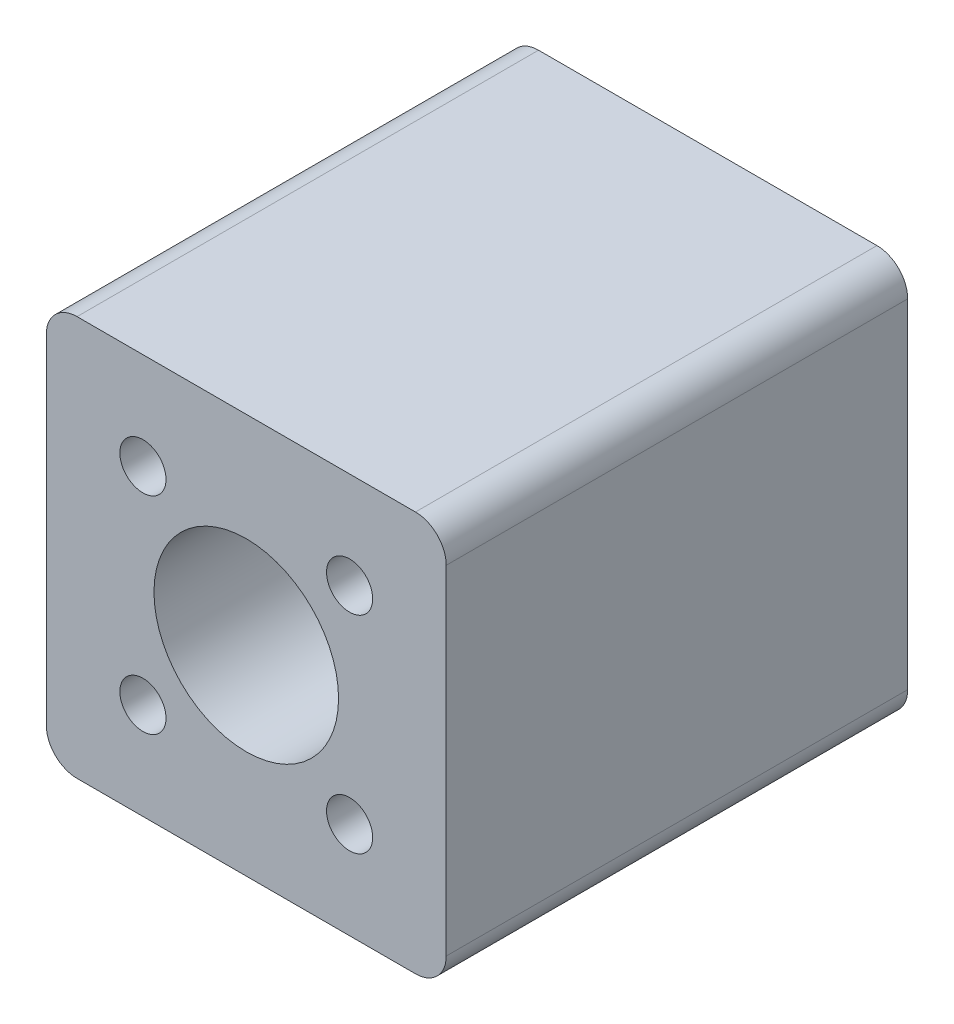
ISO-10303-21;
HEADER;
FILE_DESCRIPTION(('STEP AP214'),'2;1');
FILE_NAME('part.step','',(''),(''),'','','');
FILE_SCHEMA(('AUTOMOTIVE_DESIGN { 1 0 10303 214 1 1 1 1 }'));
ENDSEC;
DATA;
#1=APPLICATION_CONTEXT('core data for automotive mechanical design processes');
#2=APPLICATION_PROTOCOL_DEFINITION('international standard','automotive_design',2000,#1);
#3=PRODUCT_CONTEXT('',#1,'mechanical');
#4=PRODUCT('Part','Part','',(#3));
#5=PRODUCT_RELATED_PRODUCT_CATEGORY('part','',(#4));
#6=PRODUCT_DEFINITION_FORMATION('','',#4);
#7=PRODUCT_DEFINITION_CONTEXT('part definition',#1,'design');
#8=PRODUCT_DEFINITION('design','',#6,#7);
#9=PRODUCT_DEFINITION_SHAPE('','',#8);
#10=(LENGTH_UNIT() NAMED_UNIT(*) SI_UNIT(.MILLI.,.METRE.));
#11=(NAMED_UNIT(*) PLANE_ANGLE_UNIT() SI_UNIT($,.RADIAN.));
#12=(NAMED_UNIT(*) SI_UNIT($,.STERADIAN.) SOLID_ANGLE_UNIT());
#13=UNCERTAINTY_MEASURE_WITH_UNIT(LENGTH_MEASURE(1.E-05),#10,'distance_accuracy_value','');
#14=(GEOMETRIC_REPRESENTATION_CONTEXT(3) GLOBAL_UNCERTAINTY_ASSIGNED_CONTEXT((#13)) GLOBAL_UNIT_ASSIGNED_CONTEXT((#10,
#11,#12)) REPRESENTATION_CONTEXT('',''));
#15=CARTESIAN_POINT('',(0.,0.,0.));
#16=DIRECTION('',(0.,0.,1.));
#17=DIRECTION('',(1.,0.,0.));
#18=AXIS2_PLACEMENT_3D('',#15,#16,#17);
#19=CARTESIAN_POINT('',(-11.,11.,30.));
#20=DIRECTION('',(0.,0.,-1.));
#21=DIRECTION('',(-1.,0.,0.));
#22=AXIS2_PLACEMENT_3D('',#19,#20,#21);
#23=PLANE('',#22);
#24=CARTESIAN_POINT('',(-11.,11.,30.));
#25=DIRECTION('',(0.,0.,1.));
#26=DIRECTION('',(-1.,0.,0.));
#27=AXIS2_PLACEMENT_3D('',#24,#25,#26);
#28=CIRCLE('',#27,2.);
#29=CARTESIAN_POINT('',(-11.,13.,30.));
#30=VERTEX_POINT('',#29);
#31=CARTESIAN_POINT('',(-13.,11.,30.));
#32=VERTEX_POINT('',#31);
#33=EDGE_CURVE('E153',#30,#32,#28,.T.);
#34=ORIENTED_EDGE('',*,*,#33,.T.);
#35=DIRECTION('',(0.,-1.,0.));
#36=VECTOR('',#35,1.);
#37=CARTESIAN_POINT('',(-13.,-11.,30.));
#38=LINE('',#37,#36);
#39=CARTESIAN_POINT('',(-13.,-11.,30.));
#40=VERTEX_POINT('',#39);
#41=EDGE_CURVE('E97',#32,#40,#38,.T.);
#42=ORIENTED_EDGE('',*,*,#41,.T.);
#43=CARTESIAN_POINT('',(-11.,-11.,30.));
#44=DIRECTION('',(0.,0.,1.));
#45=DIRECTION('',(1.,0.,0.));
#46=AXIS2_PLACEMENT_3D('',#43,#44,#45);
#47=CIRCLE('',#46,2.);
#48=CARTESIAN_POINT('',(-11.,-13.,30.));
#49=VERTEX_POINT('',#48);
#50=EDGE_CURVE('E168',#40,#49,#47,.T.);
#51=ORIENTED_EDGE('',*,*,#50,.T.);
#52=DIRECTION('',(1.,0.,0.));
#53=VECTOR('',#52,1.);
#54=CARTESIAN_POINT('',(11.,-13.,30.));
#55=LINE('',#54,#53);
#56=CARTESIAN_POINT('',(11.,-13.,30.));
#57=VERTEX_POINT('',#56);
#58=EDGE_CURVE('E179',#49,#57,#55,.T.);
#59=ORIENTED_EDGE('',*,*,#58,.T.);
#60=CARTESIAN_POINT('',(11.,-11.,30.));
#61=DIRECTION('',(0.,0.,1.));
#62=DIRECTION('',(1.,0.,0.));
#63=AXIS2_PLACEMENT_3D('',#60,#61,#62);
#64=CIRCLE('',#63,2.);
#65=CARTESIAN_POINT('',(13.,-11.,30.));
#66=VERTEX_POINT('',#65);
#67=EDGE_CURVE('E117',#57,#66,#64,.T.);
#68=ORIENTED_EDGE('',*,*,#67,.T.);
#69=DIRECTION('',(0.,1.,0.));
#70=VECTOR('',#69,1.);
#71=CARTESIAN_POINT('',(13.,11.,30.));
#72=LINE('',#71,#70);
#73=CARTESIAN_POINT('',(13.,11.,30.));
#74=VERTEX_POINT('',#73);
#75=EDGE_CURVE('E110',#66,#74,#72,.T.);
#76=ORIENTED_EDGE('',*,*,#75,.T.);
#77=CARTESIAN_POINT('',(11.,11.,30.));
#78=DIRECTION('',(0.,0.,1.));
#79=DIRECTION('',(1.,0.,0.));
#80=AXIS2_PLACEMENT_3D('',#77,#78,#79);
#81=CIRCLE('',#80,2.);
#82=CARTESIAN_POINT('',(11.,13.,30.));
#83=VERTEX_POINT('',#82);
#84=EDGE_CURVE('E114',#74,#83,#81,.T.);
#85=ORIENTED_EDGE('',*,*,#84,.T.);
#86=DIRECTION('',(-1.,0.,0.));
#87=VECTOR('',#86,1.);
#88=CARTESIAN_POINT('',(0.,13.,30.));
#89=LINE('',#88,#87);
#90=EDGE_CURVE('E56',#83,#30,#89,.T.);
#91=ORIENTED_EDGE('',*,*,#90,.T.);
#92=EDGE_LOOP('',(#34,#42,#51,#59,#68,#76,#85,#91));
#93=FACE_BOUND('',#92,.T.);
#94=CARTESIAN_POINT('',(0.,0.,30.));
#95=DIRECTION('',(0.,0.,1.));
#96=DIRECTION('',(1.,0.,0.));
#97=AXIS2_PLACEMENT_3D('',#94,#95,#96);
#98=CIRCLE('',#97,6.);
#99=CARTESIAN_POINT('',(6.,0.,30.));
#100=VERTEX_POINT('',#99);
#101=EDGE_CURVE('E141',#100,#100,#98,.T.);
#102=ORIENTED_EDGE('',*,*,#101,.F.);
#103=EDGE_LOOP('',(#102));
#104=FACE_BOUND('',#103,.T.);
#105=CARTESIAN_POINT('',(-6.7175144212722,6.7175144212722,30.));
#106=DIRECTION('',(0.,0.,1.));
#107=DIRECTION('',(1.,0.,0.));
#108=AXIS2_PLACEMENT_3D('',#105,#106,#107);
#109=CIRCLE('',#108,1.5);
#110=CARTESIAN_POINT('',(-5.2175144212722,6.7175144212722,30.));
#111=VERTEX_POINT('',#110);
#112=EDGE_CURVE('E188',#111,#111,#109,.T.);
#113=ORIENTED_EDGE('',*,*,#112,.F.);
#114=EDGE_LOOP('',(#113));
#115=FACE_BOUND('',#114,.T.);
#116=CARTESIAN_POINT('',(6.7175144212722,6.7175144212722,30.));
#117=DIRECTION('',(0.,0.,1.));
#118=DIRECTION('',(1.,0.,0.));
#119=AXIS2_PLACEMENT_3D('',#116,#117,#118);
#120=CIRCLE('',#119,1.5);
#121=CARTESIAN_POINT('',(8.2175144212722,6.7175144212722,30.));
#122=VERTEX_POINT('',#121);
#123=EDGE_CURVE('E194',#122,#122,#120,.T.);
#124=ORIENTED_EDGE('',*,*,#123,.F.);
#125=EDGE_LOOP('',(#124));
#126=FACE_BOUND('',#125,.T.);
#127=CARTESIAN_POINT('',(-6.7175144212722,-6.7175144212722,30.));
#128=DIRECTION('',(0.,0.,1.));
#129=DIRECTION('',(1.,0.,0.));
#130=AXIS2_PLACEMENT_3D('',#127,#128,#129);
#131=CIRCLE('',#130,1.5);
#132=CARTESIAN_POINT('',(-5.2175144212722,-6.7175144212722,30.));
#133=VERTEX_POINT('',#132);
#134=EDGE_CURVE('E200',#133,#133,#131,.T.);
#135=ORIENTED_EDGE('',*,*,#134,.F.);
#136=EDGE_LOOP('',(#135));
#137=FACE_BOUND('',#136,.T.);
#138=CARTESIAN_POINT('',(6.7175144212722,-6.7175144212722,30.));
#139=DIRECTION('',(0.,0.,1.));
#140=DIRECTION('',(1.,0.,0.));
#141=AXIS2_PLACEMENT_3D('',#138,#139,#140);
#142=CIRCLE('',#141,1.5);
#143=CARTESIAN_POINT('',(8.2175144212722,-6.7175144212722,30.));
#144=VERTEX_POINT('',#143);
#145=EDGE_CURVE('E206',#144,#144,#142,.T.);
#146=ORIENTED_EDGE('',*,*,#145,.F.);
#147=EDGE_LOOP('',(#146));
#148=FACE_BOUND('',#147,.T.);
#149=ADVANCED_FACE('F39',(#93,#104,#115,#126,#137,#148),#23,.F.);
#150=CARTESIAN_POINT('',(-11.,11.,0.));
#151=DIRECTION('',(0.,0.,-1.));
#152=DIRECTION('',(-1.,0.,0.));
#153=AXIS2_PLACEMENT_3D('',#150,#151,#152);
#154=PLANE('',#153);
#155=CARTESIAN_POINT('',(-6.7175144212722,-6.7175144212722,0.));
#156=DIRECTION('',(0.,0.,1.));
#157=DIRECTION('',(1.,0.,0.));
#158=AXIS2_PLACEMENT_3D('',#155,#156,#157);
#159=CIRCLE('',#158,1.5);
#160=CARTESIAN_POINT('',(-5.2175144212722,-6.7175144212722,0.));
#161=VERTEX_POINT('',#160);
#162=EDGE_CURVE('E203',#161,#161,#159,.T.);
#163=ORIENTED_EDGE('',*,*,#162,.T.);
#164=EDGE_LOOP('',(#163));
#165=FACE_BOUND('',#164,.T.);
#166=CARTESIAN_POINT('',(-6.7175144212722,6.7175144212722,0.));
#167=DIRECTION('',(0.,0.,1.));
#168=DIRECTION('',(1.,0.,0.));
#169=AXIS2_PLACEMENT_3D('',#166,#167,#168);
#170=CIRCLE('',#169,1.5);
#171=CARTESIAN_POINT('',(-5.2175144212722,6.7175144212722,0.));
#172=VERTEX_POINT('',#171);
#173=EDGE_CURVE('E191',#172,#172,#170,.T.);
#174=ORIENTED_EDGE('',*,*,#173,.T.);
#175=EDGE_LOOP('',(#174));
#176=FACE_BOUND('',#175,.T.);
#177=CARTESIAN_POINT('',(-11.,11.,0.));
#178=DIRECTION('',(0.,0.,1.));
#179=DIRECTION('',(-1.,0.,0.));
#180=AXIS2_PLACEMENT_3D('',#177,#178,#179);
#181=CIRCLE('',#180,2.);
#182=CARTESIAN_POINT('',(-11.,13.,0.));
#183=VERTEX_POINT('',#182);
#184=CARTESIAN_POINT('',(-13.,11.,0.));
#185=VERTEX_POINT('',#184);
#186=EDGE_CURVE('E137',#183,#185,#181,.T.);
#187=ORIENTED_EDGE('',*,*,#186,.F.);
#188=DIRECTION('',(-1.,0.,0.));
#189=VECTOR('',#188,1.);
#190=CARTESIAN_POINT('',(-11.,13.,0.));
#191=LINE('',#190,#189);
#192=CARTESIAN_POINT('',(11.,13.,0.));
#193=VERTEX_POINT('',#192);
#194=EDGE_CURVE('E85',#193,#183,#191,.T.);
#195=ORIENTED_EDGE('',*,*,#194,.F.);
#196=CARTESIAN_POINT('',(11.,11.,0.));
#197=DIRECTION('',(0.,0.,1.));
#198=DIRECTION('',(1.,0.,0.));
#199=AXIS2_PLACEMENT_3D('',#196,#197,#198);
#200=CIRCLE('',#199,2.);
#201=CARTESIAN_POINT('',(13.,11.,0.));
#202=VERTEX_POINT('',#201);
#203=EDGE_CURVE('E150',#202,#193,#200,.T.);
#204=ORIENTED_EDGE('',*,*,#203,.F.);
#205=DIRECTION('',(0.,1.,0.));
#206=VECTOR('',#205,1.);
#207=CARTESIAN_POINT('',(13.,11.,0.));
#208=LINE('',#207,#206);
#209=CARTESIAN_POINT('',(13.,-11.,0.));
#210=VERTEX_POINT('',#209);
#211=EDGE_CURVE('E126',#210,#202,#208,.T.);
#212=ORIENTED_EDGE('',*,*,#211,.F.);
#213=CARTESIAN_POINT('',(11.,-11.,0.));
#214=DIRECTION('',(0.,0.,1.));
#215=DIRECTION('',(1.,0.,0.));
#216=AXIS2_PLACEMENT_3D('',#213,#214,#215);
#217=CIRCLE('',#216,2.);
#218=CARTESIAN_POINT('',(11.,-13.,0.));
#219=VERTEX_POINT('',#218);
#220=EDGE_CURVE('E147',#219,#210,#217,.T.);
#221=ORIENTED_EDGE('',*,*,#220,.F.);
#222=DIRECTION('',(1.,0.,0.));
#223=VECTOR('',#222,1.);
#224=CARTESIAN_POINT('',(11.,-13.,0.));
#225=LINE('',#224,#223);
#226=CARTESIAN_POINT('',(-11.,-13.,0.));
#227=VERTEX_POINT('',#226);
#228=EDGE_CURVE('E145',#227,#219,#225,.T.);
#229=ORIENTED_EDGE('',*,*,#228,.F.);
#230=CARTESIAN_POINT('',(-11.,-11.,0.));
#231=DIRECTION('',(0.,0.,1.));
#232=DIRECTION('',(1.,0.,0.));
#233=AXIS2_PLACEMENT_3D('',#230,#231,#232);
#234=CIRCLE('',#233,2.);
#235=CARTESIAN_POINT('',(-13.,-11.,0.));
#236=VERTEX_POINT('',#235);
#237=EDGE_CURVE('E143',#236,#227,#234,.T.);
#238=ORIENTED_EDGE('',*,*,#237,.F.);
#239=DIRECTION('',(0.,-1.,0.));
#240=VECTOR('',#239,1.);
#241=CARTESIAN_POINT('',(-13.,-11.,0.));
#242=LINE('',#241,#240);
#243=EDGE_CURVE('E140',#185,#236,#242,.T.);
#244=ORIENTED_EDGE('',*,*,#243,.F.);
#245=EDGE_LOOP('',(#187,#195,#204,#212,#221,#229,#238,#244));
#246=FACE_BOUND('',#245,.T.);
#247=CARTESIAN_POINT('',(0.,0.,0.));
#248=DIRECTION('',(0.,0.,1.));
#249=DIRECTION('',(1.,0.,0.));
#250=AXIS2_PLACEMENT_3D('',#247,#248,#249);
#251=CIRCLE('',#250,6.);
#252=CARTESIAN_POINT('',(6.,0.,0.));
#253=VERTEX_POINT('',#252);
#254=EDGE_CURVE('E185',#253,#253,#251,.T.);
#255=ORIENTED_EDGE('',*,*,#254,.T.);
#256=EDGE_LOOP('',(#255));
#257=FACE_BOUND('',#256,.T.);
#258=CARTESIAN_POINT('',(6.7175144212722,6.7175144212722,0.));
#259=DIRECTION('',(0.,0.,1.));
#260=DIRECTION('',(1.,0.,0.));
#261=AXIS2_PLACEMENT_3D('',#258,#259,#260);
#262=CIRCLE('',#261,1.5);
#263=CARTESIAN_POINT('',(8.2175144212722,6.7175144212722,0.));
#264=VERTEX_POINT('',#263);
#265=EDGE_CURVE('E197',#264,#264,#262,.T.);
#266=ORIENTED_EDGE('',*,*,#265,.T.);
#267=EDGE_LOOP('',(#266));
#268=FACE_BOUND('',#267,.T.);
#269=CARTESIAN_POINT('',(6.7175144212722,-6.7175144212722,0.));
#270=DIRECTION('',(0.,0.,1.));
#271=DIRECTION('',(1.,0.,0.));
#272=AXIS2_PLACEMENT_3D('',#269,#270,#271);
#273=CIRCLE('',#272,1.5);
#274=CARTESIAN_POINT('',(8.2175144212722,-6.7175144212722,0.));
#275=VERTEX_POINT('',#274);
#276=EDGE_CURVE('E209',#275,#275,#273,.T.);
#277=ORIENTED_EDGE('',*,*,#276,.T.);
#278=EDGE_LOOP('',(#277));
#279=FACE_BOUND('',#278,.T.);
#280=ADVANCED_FACE('F170',(#165,#176,#246,#257,#268,#279),#154,.T.);
#281=CARTESIAN_POINT('',(-11.,11.,30.));
#282=DIRECTION('',(0.,0.,-1.));
#283=DIRECTION('',(-1.,0.,0.));
#284=AXIS2_PLACEMENT_3D('',#281,#282,#283);
#285=CYLINDRICAL_SURFACE('',#284,2.);
#286=ORIENTED_EDGE('',*,*,#186,.T.);
#287=DIRECTION('',(0.,0.,-1.));
#288=VECTOR('',#287,1.);
#289=CARTESIAN_POINT('',(-13.,11.,30.));
#290=LINE('',#289,#288);
#291=EDGE_CURVE('E11',#32,#185,#290,.T.);
#292=ORIENTED_EDGE('',*,*,#291,.F.);
#293=ORIENTED_EDGE('',*,*,#33,.F.);
#294=DIRECTION('',(0.,0.,-1.));
#295=VECTOR('',#294,1.);
#296=CARTESIAN_POINT('',(-11.,13.,30.));
#297=LINE('',#296,#295);
#298=EDGE_CURVE('E133',#30,#183,#297,.T.);
#299=ORIENTED_EDGE('',*,*,#298,.T.);
#300=EDGE_LOOP('',(#286,#292,#293,#299));
#301=FACE_BOUND('',#300,.T.);
#302=ADVANCED_FACE('F41',(#301),#285,.T.);
#303=CARTESIAN_POINT('',(-13.,-11.,30.));
#304=DIRECTION('',(1.,0.,0.));
#305=DIRECTION('',(0.,0.,-1.));
#306=AXIS2_PLACEMENT_3D('',#303,#304,#305);
#307=PLANE('',#306);
#308=ORIENTED_EDGE('',*,*,#243,.T.);
#309=DIRECTION('',(0.,0.,-1.));
#310=VECTOR('',#309,1.);
#311=CARTESIAN_POINT('',(-13.,-11.,30.));
#312=LINE('',#311,#310);
#313=EDGE_CURVE('E48',#40,#236,#312,.T.);
#314=ORIENTED_EDGE('',*,*,#313,.F.);
#315=ORIENTED_EDGE('',*,*,#41,.F.);
#316=ORIENTED_EDGE('',*,*,#291,.T.);
#317=EDGE_LOOP('',(#308,#314,#315,#316));
#318=FACE_BOUND('',#317,.T.);
#319=ADVANCED_FACE('F241',(#318),#307,.F.);
#320=CARTESIAN_POINT('',(-11.,-11.,30.));
#321=DIRECTION('',(0.,0.,-1.));
#322=DIRECTION('',(-1.,0.,0.));
#323=AXIS2_PLACEMENT_3D('',#320,#321,#322);
#324=CYLINDRICAL_SURFACE('',#323,2.);
#325=ORIENTED_EDGE('',*,*,#237,.T.);
#326=DIRECTION('',(0.,0.,-1.));
#327=VECTOR('',#326,1.);
#328=CARTESIAN_POINT('',(-11.,-13.,30.));
#329=LINE('',#328,#327);
#330=EDGE_CURVE('E160',#49,#227,#329,.T.);
#331=ORIENTED_EDGE('',*,*,#330,.F.);
#332=ORIENTED_EDGE('',*,*,#50,.F.);
#333=ORIENTED_EDGE('',*,*,#313,.T.);
#334=EDGE_LOOP('',(#325,#331,#332,#333));
#335=FACE_BOUND('',#334,.T.);
#336=ADVANCED_FACE('F166',(#335),#324,.T.);
#337=CARTESIAN_POINT('',(11.,-13.,30.));
#338=DIRECTION('',(0.,1.,0.));
#339=DIRECTION('',(0.,0.,1.));
#340=AXIS2_PLACEMENT_3D('',#337,#338,#339);
#341=PLANE('',#340);
#342=ORIENTED_EDGE('',*,*,#228,.T.);
#343=DIRECTION('',(0.,0.,-1.));
#344=VECTOR('',#343,1.);
#345=CARTESIAN_POINT('',(11.,-13.,30.));
#346=LINE('',#345,#344);
#347=EDGE_CURVE('E157',#57,#219,#346,.T.);
#348=ORIENTED_EDGE('',*,*,#347,.F.);
#349=ORIENTED_EDGE('',*,*,#58,.F.);
#350=ORIENTED_EDGE('',*,*,#330,.T.);
#351=EDGE_LOOP('',(#342,#348,#349,#350));
#352=FACE_BOUND('',#351,.T.);
#353=ADVANCED_FACE('F175',(#352),#341,.F.);
#354=CARTESIAN_POINT('',(11.,-11.,30.));
#355=DIRECTION('',(0.,0.,-1.));
#356=DIRECTION('',(-1.,0.,0.));
#357=AXIS2_PLACEMENT_3D('',#354,#355,#356);
#358=CYLINDRICAL_SURFACE('',#357,2.);
#359=ORIENTED_EDGE('',*,*,#220,.T.);
#360=DIRECTION('',(0.,0.,-1.));
#361=VECTOR('',#360,1.);
#362=CARTESIAN_POINT('',(13.,-11.,30.));
#363=LINE('',#362,#361);
#364=EDGE_CURVE('E128',#66,#210,#363,.T.);
#365=ORIENTED_EDGE('',*,*,#364,.F.);
#366=ORIENTED_EDGE('',*,*,#67,.F.);
#367=ORIENTED_EDGE('',*,*,#347,.T.);
#368=EDGE_LOOP('',(#359,#365,#366,#367));
#369=FACE_BOUND('',#368,.T.);
#370=ADVANCED_FACE('F178',(#369),#358,.T.);
#371=CARTESIAN_POINT('',(13.,11.,30.));
#372=DIRECTION('',(-1.,0.,0.));
#373=DIRECTION('',(0.,0.,1.));
#374=AXIS2_PLACEMENT_3D('',#371,#372,#373);
#375=PLANE('',#374);
#376=ORIENTED_EDGE('',*,*,#211,.T.);
#377=DIRECTION('',(0.,0.,-1.));
#378=VECTOR('',#377,1.);
#379=CARTESIAN_POINT('',(13.,11.,30.));
#380=LINE('',#379,#378);
#381=EDGE_CURVE('E123',#74,#202,#380,.T.);
#382=ORIENTED_EDGE('',*,*,#381,.F.);
#383=ORIENTED_EDGE('',*,*,#75,.F.);
#384=ORIENTED_EDGE('',*,*,#364,.T.);
#385=EDGE_LOOP('',(#376,#382,#383,#384));
#386=FACE_BOUND('',#385,.T.);
#387=ADVANCED_FACE('F124',(#386),#375,.F.);
#388=CARTESIAN_POINT('',(11.,11.,30.));
#389=DIRECTION('',(0.,0.,-1.));
#390=DIRECTION('',(-1.,0.,0.));
#391=AXIS2_PLACEMENT_3D('',#388,#389,#390);
#392=CYLINDRICAL_SURFACE('',#391,2.);
#393=ORIENTED_EDGE('',*,*,#203,.T.);
#394=DIRECTION('',(0.,0.,-1.));
#395=VECTOR('',#394,1.);
#396=CARTESIAN_POINT('',(11.,13.,30.));
#397=LINE('',#396,#395);
#398=EDGE_CURVE('E129',#83,#193,#397,.T.);
#399=ORIENTED_EDGE('',*,*,#398,.F.);
#400=ORIENTED_EDGE('',*,*,#84,.F.);
#401=ORIENTED_EDGE('',*,*,#381,.T.);
#402=EDGE_LOOP('',(#393,#399,#400,#401));
#403=FACE_BOUND('',#402,.T.);
#404=ADVANCED_FACE('F131',(#403),#392,.T.);
#405=CARTESIAN_POINT('',(-11.,13.,30.));
#406=DIRECTION('',(0.,-1.,0.));
#407=DIRECTION('',(0.,0.,-1.));
#408=AXIS2_PLACEMENT_3D('',#405,#406,#407);
#409=PLANE('',#408);
#410=ORIENTED_EDGE('',*,*,#194,.T.);
#411=ORIENTED_EDGE('',*,*,#298,.F.);
#412=ORIENTED_EDGE('',*,*,#90,.F.);
#413=ORIENTED_EDGE('',*,*,#398,.T.);
#414=EDGE_LOOP('',(#410,#411,#412,#413));
#415=FACE_BOUND('',#414,.T.);
#416=ADVANCED_FACE('F229',(#415),#409,.F.);
#417=CARTESIAN_POINT('',(0.,0.,30.));
#418=DIRECTION('',(0.,0.,-1.));
#419=DIRECTION('',(-1.,0.,0.));
#420=AXIS2_PLACEMENT_3D('',#417,#418,#419);
#421=CYLINDRICAL_SURFACE('',#420,6.);
#422=ORIENTED_EDGE('',*,*,#101,.T.);
#423=EDGE_LOOP('',(#422));
#424=FACE_BOUND('',#423,.T.);
#425=ORIENTED_EDGE('',*,*,#254,.F.);
#426=EDGE_LOOP('',(#425));
#427=FACE_BOUND('',#426,.T.);
#428=ADVANCED_FACE('F226',(#424,#427),#421,.F.);
#429=CARTESIAN_POINT('',(-6.7175144212722,6.7175144212722,30.));
#430=DIRECTION('',(0.,0.,-1.));
#431=DIRECTION('',(-1.,0.,0.));
#432=AXIS2_PLACEMENT_3D('',#429,#430,#431);
#433=CYLINDRICAL_SURFACE('',#432,1.5);
#434=ORIENTED_EDGE('',*,*,#112,.T.);
#435=EDGE_LOOP('',(#434));
#436=FACE_BOUND('',#435,.T.);
#437=ORIENTED_EDGE('',*,*,#173,.F.);
#438=EDGE_LOOP('',(#437));
#439=FACE_BOUND('',#438,.T.);
#440=ADVANCED_FACE('F293',(#436,#439),#433,.F.);
#441=CARTESIAN_POINT('',(6.7175144212722,6.7175144212722,30.));
#442=DIRECTION('',(0.,0.,-1.));
#443=DIRECTION('',(-1.,0.,0.));
#444=AXIS2_PLACEMENT_3D('',#441,#442,#443);
#445=CYLINDRICAL_SURFACE('',#444,1.5);
#446=ORIENTED_EDGE('',*,*,#123,.T.);
#447=EDGE_LOOP('',(#446));
#448=FACE_BOUND('',#447,.T.);
#449=ORIENTED_EDGE('',*,*,#265,.F.);
#450=EDGE_LOOP('',(#449));
#451=FACE_BOUND('',#450,.T.);
#452=ADVANCED_FACE('F300',(#448,#451),#445,.F.);
#453=CARTESIAN_POINT('',(-6.7175144212722,-6.7175144212722,30.));
#454=DIRECTION('',(0.,0.,-1.));
#455=DIRECTION('',(-1.,0.,0.));
#456=AXIS2_PLACEMENT_3D('',#453,#454,#455);
#457=CYLINDRICAL_SURFACE('',#456,1.5);
#458=ORIENTED_EDGE('',*,*,#134,.T.);
#459=EDGE_LOOP('',(#458));
#460=FACE_BOUND('',#459,.T.);
#461=ORIENTED_EDGE('',*,*,#162,.F.);
#462=EDGE_LOOP('',(#461));
#463=FACE_BOUND('',#462,.T.);
#464=ADVANCED_FACE('F307',(#460,#463),#457,.F.);
#465=CARTESIAN_POINT('',(6.7175144212722,-6.7175144212722,30.));
#466=DIRECTION('',(0.,0.,-1.));
#467=DIRECTION('',(-1.,0.,0.));
#468=AXIS2_PLACEMENT_3D('',#465,#466,#467);
#469=CYLINDRICAL_SURFACE('',#468,1.5);
#470=ORIENTED_EDGE('',*,*,#145,.T.);
#471=EDGE_LOOP('',(#470));
#472=FACE_BOUND('',#471,.T.);
#473=ORIENTED_EDGE('',*,*,#276,.F.);
#474=EDGE_LOOP('',(#473));
#475=FACE_BOUND('',#474,.T.);
#476=ADVANCED_FACE('F215',(#472,#475),#469,.F.);
#477=CLOSED_SHELL('',(#149,#280,#302,#319,#336,#353,#370,#387,#404,#416,#428,#440,#452,#464,#476));
#478=MANIFOLD_SOLID_BREP('B2',#477);
#479=ADVANCED_BREP_SHAPE_REPRESENTATION('',(#18,#478),#14);
#480=SHAPE_DEFINITION_REPRESENTATION(#9,#479);
ENDSEC;
END-ISO-10303-21;
